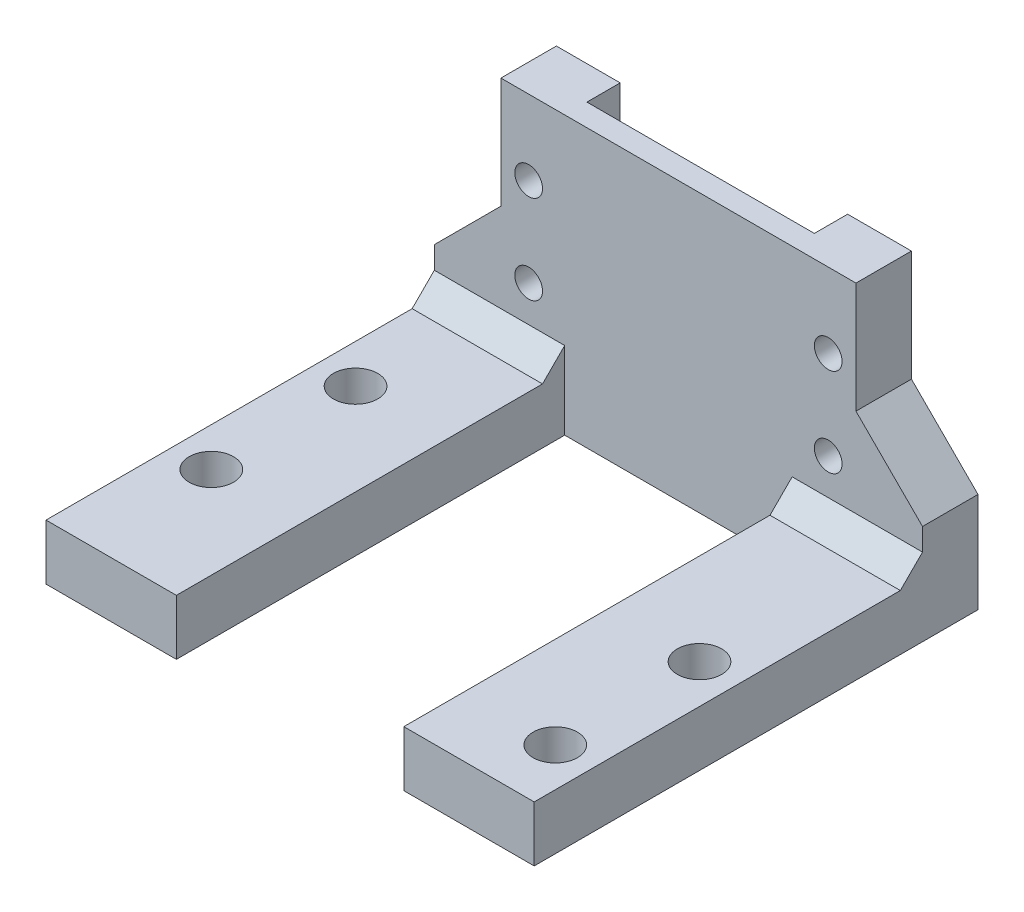
ISO-10303-21;
HEADER;
FILE_DESCRIPTION(('STEP AP214'),'2;1');
FILE_NAME('part.step','',(''),(''),'','','');
FILE_SCHEMA(('AUTOMOTIVE_DESIGN { 1 0 10303 214 1 1 1 1 }'));
ENDSEC;
DATA;
#1=APPLICATION_CONTEXT('core data for automotive mechanical design processes');
#2=APPLICATION_PROTOCOL_DEFINITION('international standard','automotive_design',2000,#1);
#3=PRODUCT_CONTEXT('',#1,'mechanical');
#4=PRODUCT('Part','Part','',(#3));
#5=PRODUCT_RELATED_PRODUCT_CATEGORY('part','',(#4));
#6=PRODUCT_DEFINITION_FORMATION('','',#4);
#7=PRODUCT_DEFINITION_CONTEXT('part definition',#1,'design');
#8=PRODUCT_DEFINITION('design','',#6,#7);
#9=PRODUCT_DEFINITION_SHAPE('','',#8);
#10=(LENGTH_UNIT() NAMED_UNIT(*) SI_UNIT(.MILLI.,.METRE.));
#11=(NAMED_UNIT(*) PLANE_ANGLE_UNIT() SI_UNIT($,.RADIAN.));
#12=(NAMED_UNIT(*) SI_UNIT($,.STERADIAN.) SOLID_ANGLE_UNIT());
#13=UNCERTAINTY_MEASURE_WITH_UNIT(LENGTH_MEASURE(1.E-05),#10,'distance_accuracy_value','');
#14=(GEOMETRIC_REPRESENTATION_CONTEXT(3) GLOBAL_UNCERTAINTY_ASSIGNED_CONTEXT((#13)) GLOBAL_UNIT_ASSIGNED_CONTEXT((#10,
#11,#12)) REPRESENTATION_CONTEXT('',''));
#15=CARTESIAN_POINT('',(0.,0.,0.));
#16=DIRECTION('',(0.,0.,1.));
#17=DIRECTION('',(1.,0.,0.));
#18=AXIS2_PLACEMENT_3D('',#15,#16,#17);
#19=CARTESIAN_POINT('',(0.,0.,2.));
#20=DIRECTION('',(0.,0.,1.));
#21=DIRECTION('',(1.,0.,0.));
#22=AXIS2_PLACEMENT_3D('',#19,#20,#21);
#23=PLANE('',#22);
#24=CARTESIAN_POINT('',(13.5,-2.25,2.));
#25=DIRECTION('',(0.,0.,1.));
#26=DIRECTION('',(1.,0.,0.));
#27=AXIS2_PLACEMENT_3D('',#24,#25,#26);
#28=CIRCLE('',#27,1.25);
#29=CARTESIAN_POINT('',(14.75,-2.25,2.));
#30=VERTEX_POINT('',#29);
#31=EDGE_CURVE('E808',#30,#30,#28,.F.);
#32=ORIENTED_EDGE('',*,*,#31,.T.);
#33=EDGE_LOOP('',(#32));
#34=FACE_BOUND('',#33,.T.);
#35=CARTESIAN_POINT('',(-13.5,-2.24999999999999,2.));
#36=DIRECTION('',(0.,0.,1.));
#37=DIRECTION('',(1.,0.,0.));
#38=AXIS2_PLACEMENT_3D('',#35,#36,#37);
#39=CIRCLE('',#38,1.25);
#40=CARTESIAN_POINT('',(-12.25,-2.24999999999999,2.));
#41=VERTEX_POINT('',#40);
#42=EDGE_CURVE('E805',#41,#41,#39,.T.);
#43=ORIENTED_EDGE('',*,*,#42,.F.);
#44=EDGE_LOOP('',(#43));
#45=FACE_BOUND('',#44,.T.);
#46=CARTESIAN_POINT('',(-13.5,5.75000000000001,2.));
#47=DIRECTION('',(0.,0.,1.));
#48=DIRECTION('',(1.,0.,0.));
#49=AXIS2_PLACEMENT_3D('',#46,#47,#48);
#50=CIRCLE('',#49,1.25);
#51=CARTESIAN_POINT('',(-12.25,5.75000000000001,2.));
#52=VERTEX_POINT('',#51);
#53=EDGE_CURVE('E215',#52,#52,#50,.T.);
#54=ORIENTED_EDGE('',*,*,#53,.F.);
#55=EDGE_LOOP('',(#54));
#56=FACE_BOUND('',#55,.T.);
#57=DIRECTION('',(0.,1.,0.));
#58=VECTOR('',#57,1.);
#59=CARTESIAN_POINT('',(-22.,0.,2.));
#60=LINE('',#59,#58);
#61=CARTESIAN_POINT('',(-22.,-5.49999999999999,2.));
#62=VERTEX_POINT('',#61);
#63=CARTESIAN_POINT('',(-22.,-3.49999999999987,2.));
#64=VERTEX_POINT('',#63);
#65=EDGE_CURVE('E338',#62,#64,#60,.T.);
#66=ORIENTED_EDGE('',*,*,#65,.F.);
#67=DIRECTION('',(1.,0.,0.));
#68=VECTOR('',#67,1.);
#69=CARTESIAN_POINT('',(0.,-5.49999999999999,2.));
#70=LINE('',#69,#68);
#71=CARTESIAN_POINT('',(-10.25,-5.49999999999999,2.));
#72=VERTEX_POINT('',#71);
#73=EDGE_CURVE('E345',#62,#72,#70,.T.);
#74=ORIENTED_EDGE('',*,*,#73,.T.);
#75=DIRECTION('',(0.,1.,0.));
#76=VECTOR('',#75,1.);
#77=CARTESIAN_POINT('',(-10.25,0.,2.));
#78=LINE('',#77,#76);
#79=CARTESIAN_POINT('',(-10.25,-12.5,2.));
#80=VERTEX_POINT('',#79);
#81=EDGE_CURVE('E221',#80,#72,#78,.T.);
#82=ORIENTED_EDGE('',*,*,#81,.F.);
#83=DIRECTION('',(1.,0.,0.));
#84=VECTOR('',#83,1.);
#85=CARTESIAN_POINT('',(16.,-12.5,2.));
#86=LINE('',#85,#84);
#87=CARTESIAN_POINT('',(10.25,-12.5,2.));
#88=VERTEX_POINT('',#87);
#89=EDGE_CURVE('E289',#80,#88,#86,.T.);
#90=ORIENTED_EDGE('',*,*,#89,.T.);
#91=DIRECTION('',(0.,1.,0.));
#92=VECTOR('',#91,1.);
#93=CARTESIAN_POINT('',(10.25,0.,2.));
#94=LINE('',#93,#92);
#95=CARTESIAN_POINT('',(10.25,-5.49999999999999,2.));
#96=VERTEX_POINT('',#95);
#97=EDGE_CURVE('E243',#88,#96,#94,.T.);
#98=ORIENTED_EDGE('',*,*,#97,.T.);
#99=DIRECTION('',(1.,0.,0.));
#100=VECTOR('',#99,1.);
#101=CARTESIAN_POINT('',(0.,-5.49999999999999,2.));
#102=LINE('',#101,#100);
#103=CARTESIAN_POINT('',(22.,-5.49999999999999,2.));
#104=VERTEX_POINT('',#103);
#105=EDGE_CURVE('E341',#96,#104,#102,.T.);
#106=ORIENTED_EDGE('',*,*,#105,.T.);
#107=DIRECTION('',(0.,-1.,0.));
#108=VECTOR('',#107,1.);
#109=CARTESIAN_POINT('',(22.,0.,2.));
#110=LINE('',#109,#108);
#111=CARTESIAN_POINT('',(22.,-3.49999999999986,2.));
#112=VERTEX_POINT('',#111);
#113=EDGE_CURVE('E339',#104,#112,#110,.F.);
#114=ORIENTED_EDGE('',*,*,#113,.T.);
#115=DIRECTION('',(0.707106781186551,-0.707106781186544,0.));
#116=VECTOR('',#115,1.);
#117=CARTESIAN_POINT('',(26.0000000000002,-7.5,2.));
#118=LINE('',#117,#116);
#119=CARTESIAN_POINT('',(16.,2.50000000000007,2.));
#120=VERTEX_POINT('',#119);
#121=EDGE_CURVE('E325',#112,#120,#118,.F.);
#122=ORIENTED_EDGE('',*,*,#121,.T.);
#123=DIRECTION('',(0.,1.,0.));
#124=VECTOR('',#123,1.);
#125=CARTESIAN_POINT('',(16.,-12.5,2.));
#126=LINE('',#125,#124);
#127=CARTESIAN_POINT('',(16.,12.5,2.));
#128=VERTEX_POINT('',#127);
#129=EDGE_CURVE('E292',#120,#128,#126,.T.);
#130=ORIENTED_EDGE('',*,*,#129,.T.);
#131=DIRECTION('',(-1.,0.,0.));
#132=VECTOR('',#131,1.);
#133=CARTESIAN_POINT('',(16.,12.5,2.));
#134=LINE('',#133,#132);
#135=CARTESIAN_POINT('',(-16.,12.5,2.));
#136=VERTEX_POINT('',#135);
#137=EDGE_CURVE('E294',#128,#136,#134,.T.);
#138=ORIENTED_EDGE('',*,*,#137,.T.);
#139=DIRECTION('',(0.,-1.,0.));
#140=VECTOR('',#139,1.);
#141=CARTESIAN_POINT('',(-16.,-12.5,2.));
#142=LINE('',#141,#140);
#143=CARTESIAN_POINT('',(-16.,2.50000000000007,2.));
#144=VERTEX_POINT('',#143);
#145=EDGE_CURVE('E286',#136,#144,#142,.T.);
#146=ORIENTED_EDGE('',*,*,#145,.T.);
#147=DIRECTION('',(0.707106781186551,0.707106781186544,0.));
#148=VECTOR('',#147,1.);
#149=CARTESIAN_POINT('',(-26.0000000000002,-7.5,2.));
#150=LINE('',#149,#148);
#151=EDGE_CURVE('E335',#144,#64,#150,.F.);
#152=ORIENTED_EDGE('',*,*,#151,.T.);
#153=EDGE_LOOP('',(#66,#74,#82,#90,#98,#106,#114,#122,#130,#138,#146,#152));
#154=FACE_BOUND('',#153,.T.);
#155=CARTESIAN_POINT('',(13.5,5.75000000000001,2.));
#156=DIRECTION('',(0.,0.,1.));
#157=DIRECTION('',(1.,0.,0.));
#158=AXIS2_PLACEMENT_3D('',#155,#156,#157);
#159=CIRCLE('',#158,1.25);
#160=CARTESIAN_POINT('',(14.75,5.75000000000001,2.));
#161=VERTEX_POINT('',#160);
#162=EDGE_CURVE('E804',#161,#161,#159,.F.);
#163=ORIENTED_EDGE('',*,*,#162,.T.);
#164=EDGE_LOOP('',(#163));
#165=FACE_BOUND('',#164,.T.);
#166=ADVANCED_FACE('F45',(#34,#45,#56,#154,#165),#23,.T.);
#167=CARTESIAN_POINT('',(-16.,-12.5,2.));
#168=DIRECTION('',(1.,0.,0.));
#169=DIRECTION('',(0.,0.,-1.));
#170=AXIS2_PLACEMENT_3D('',#167,#168,#169);
#171=PLANE('',#170);
#172=DIRECTION('',(0.,1.,0.));
#173=VECTOR('',#172,1.);
#174=CARTESIAN_POINT('',(-16.,0.,-3.));
#175=LINE('',#174,#173);
#176=CARTESIAN_POINT('',(-16.,2.50000000000007,-3.));
#177=VERTEX_POINT('',#176);
#178=CARTESIAN_POINT('',(-16.,12.5,-3.));
#179=VERTEX_POINT('',#178);
#180=EDGE_CURVE('E259',#177,#179,#175,.T.);
#181=ORIENTED_EDGE('',*,*,#180,.F.);
#182=DIRECTION('',(0.,0.,1.));
#183=VECTOR('',#182,1.);
#184=CARTESIAN_POINT('',(-16.,2.50000000000007,2.));
#185=LINE('',#184,#183);
#186=EDGE_CURVE('E319',#177,#144,#185,.T.);
#187=ORIENTED_EDGE('',*,*,#186,.T.);
#188=ORIENTED_EDGE('',*,*,#145,.F.);
#189=DIRECTION('',(0.,0.,-1.));
#190=VECTOR('',#189,1.);
#191=CARTESIAN_POINT('',(-16.,12.5,2.));
#192=LINE('',#191,#190);
#193=EDGE_CURVE('E296',#136,#179,#192,.T.);
#194=ORIENTED_EDGE('',*,*,#193,.T.);
#195=EDGE_LOOP('',(#181,#187,#188,#194));
#196=FACE_BOUND('',#195,.T.);
#197=ADVANCED_FACE('F396',(#196),#171,.F.);
#198=CARTESIAN_POINT('',(16.,-12.5,2.));
#199=DIRECTION('',(-1.,0.,0.));
#200=DIRECTION('',(0.,0.,1.));
#201=AXIS2_PLACEMENT_3D('',#198,#199,#200);
#202=PLANE('',#201);
#203=ORIENTED_EDGE('',*,*,#129,.F.);
#204=DIRECTION('',(0.,0.,-1.));
#205=VECTOR('',#204,1.);
#206=CARTESIAN_POINT('',(16.,2.50000000000007,-3.));
#207=LINE('',#206,#205);
#208=CARTESIAN_POINT('',(16.,2.50000000000007,-3.));
#209=VERTEX_POINT('',#208);
#210=EDGE_CURVE('E305',#120,#209,#207,.T.);
#211=ORIENTED_EDGE('',*,*,#210,.T.);
#212=DIRECTION('',(0.,-1.,0.));
#213=VECTOR('',#212,1.);
#214=CARTESIAN_POINT('',(16.,0.,-3.));
#215=LINE('',#214,#213);
#216=CARTESIAN_POINT('',(16.,12.5,-3.));
#217=VERTEX_POINT('',#216);
#218=EDGE_CURVE('E273',#217,#209,#215,.T.);
#219=ORIENTED_EDGE('',*,*,#218,.F.);
#220=DIRECTION('',(0.,0.,-1.));
#221=VECTOR('',#220,1.);
#222=CARTESIAN_POINT('',(16.,12.5,2.));
#223=LINE('',#222,#221);
#224=EDGE_CURVE('E303',#128,#217,#223,.T.);
#225=ORIENTED_EDGE('',*,*,#224,.F.);
#226=EDGE_LOOP('',(#203,#211,#219,#225));
#227=FACE_BOUND('',#226,.T.);
#228=ADVANCED_FACE('F385',(#227),#202,.F.);
#229=CARTESIAN_POINT('',(0.,0.,0.));
#230=DIRECTION('',(0.,0.,1.));
#231=DIRECTION('',(1.,0.,0.));
#232=AXIS2_PLACEMENT_3D('',#229,#230,#231);
#233=PLANE('',#232);
#234=DIRECTION('',(0.,-1.,0.));
#235=VECTOR('',#234,1.);
#236=CARTESIAN_POINT('',(-10.25,0.,0.));
#237=LINE('',#236,#235);
#238=CARTESIAN_POINT('',(-10.25,12.5,0.));
#239=VERTEX_POINT('',#238);
#240=CARTESIAN_POINT('',(-10.25,-12.5,0.));
#241=VERTEX_POINT('',#240);
#242=EDGE_CURVE('E251',#239,#241,#237,.T.);
#243=ORIENTED_EDGE('',*,*,#242,.F.);
#244=DIRECTION('',(-1.,0.,0.));
#245=VECTOR('',#244,1.);
#246=CARTESIAN_POINT('',(16.,12.5,0.));
#247=LINE('',#246,#245);
#248=CARTESIAN_POINT('',(10.25,12.5,0.));
#249=VERTEX_POINT('',#248);
#250=EDGE_CURVE('E290',#249,#239,#247,.T.);
#251=ORIENTED_EDGE('',*,*,#250,.F.);
#252=DIRECTION('',(0.,-1.,0.));
#253=VECTOR('',#252,1.);
#254=CARTESIAN_POINT('',(10.25,0.,0.));
#255=LINE('',#254,#253);
#256=CARTESIAN_POINT('',(10.25,-12.5,0.));
#257=VERTEX_POINT('',#256);
#258=EDGE_CURVE('E267',#249,#257,#255,.T.);
#259=ORIENTED_EDGE('',*,*,#258,.T.);
#260=DIRECTION('',(1.,0.,0.));
#261=VECTOR('',#260,1.);
#262=CARTESIAN_POINT('',(16.,-12.5,0.));
#263=LINE('',#262,#261);
#264=EDGE_CURVE('E285',#241,#257,#263,.T.);
#265=ORIENTED_EDGE('',*,*,#264,.F.);
#266=EDGE_LOOP('',(#243,#251,#259,#265));
#267=FACE_BOUND('',#266,.T.);
#268=ADVANCED_FACE('F410',(#267),#233,.F.);
#269=CARTESIAN_POINT('',(16.,-12.5,2.));
#270=DIRECTION('',(0.,1.,0.));
#271=DIRECTION('',(-1.,0.,0.));
#272=AXIS2_PLACEMENT_3D('',#269,#270,#271);
#273=PLANE('',#272);
#274=CARTESIAN_POINT('',(18.5,-12.5,31.6));
#275=DIRECTION('',(0.,1.,0.));
#276=DIRECTION('',(-1.,0.,0.));
#277=AXIS2_PLACEMENT_3D('',#274,#275,#276);
#278=CIRCLE('',#277,2.);
#279=CARTESIAN_POINT('',(16.5,-12.5,31.6));
#280=VERTEX_POINT('',#279);
#281=EDGE_CURVE('E801',#280,#280,#278,.T.);
#282=ORIENTED_EDGE('',*,*,#281,.T.);
#283=EDGE_LOOP('',(#282));
#284=FACE_BOUND('',#283,.T.);
#285=CARTESIAN_POINT('',(18.5,-12.5,18.6));
#286=DIRECTION('',(0.,1.,0.));
#287=DIRECTION('',(-1.,0.,0.));
#288=AXIS2_PLACEMENT_3D('',#285,#286,#287);
#289=CIRCLE('',#288,2.);
#290=CARTESIAN_POINT('',(16.5,-12.5,18.6));
#291=VERTEX_POINT('',#290);
#292=EDGE_CURVE('E798',#291,#291,#289,.T.);
#293=ORIENTED_EDGE('',*,*,#292,.T.);
#294=EDGE_LOOP('',(#293));
#295=FACE_BOUND('',#294,.T.);
#296=CARTESIAN_POINT('',(-18.5,-12.5,25.6));
#297=DIRECTION('',(0.,1.,0.));
#298=DIRECTION('',(-1.,0.,0.));
#299=AXIS2_PLACEMENT_3D('',#296,#297,#298);
#300=CIRCLE('',#299,2.);
#301=CARTESIAN_POINT('',(-20.5,-12.5,25.6));
#302=VERTEX_POINT('',#301);
#303=EDGE_CURVE('E795',#302,#302,#300,.T.);
#304=ORIENTED_EDGE('',*,*,#303,.T.);
#305=EDGE_LOOP('',(#304));
#306=FACE_BOUND('',#305,.T.);
#307=CARTESIAN_POINT('',(-18.5,-12.5,12.6));
#308=DIRECTION('',(0.,1.,0.));
#309=DIRECTION('',(-1.,0.,0.));
#310=AXIS2_PLACEMENT_3D('',#307,#308,#309);
#311=CIRCLE('',#310,2.);
#312=CARTESIAN_POINT('',(-20.5,-12.5,12.6));
#313=VERTEX_POINT('',#312);
#314=EDGE_CURVE('E785',#313,#313,#311,.T.);
#315=ORIENTED_EDGE('',*,*,#314,.T.);
#316=EDGE_LOOP('',(#315));
#317=FACE_BOUND('',#316,.T.);
#318=ORIENTED_EDGE('',*,*,#89,.F.);
#319=DIRECTION('',(0.,0.,-1.));
#320=VECTOR('',#319,1.);
#321=CARTESIAN_POINT('',(-10.25,-12.5,37.));
#322=LINE('',#321,#320);
#323=CARTESIAN_POINT('',(-10.25,-12.5,37.));
#324=VERTEX_POINT('',#323);
#325=EDGE_CURVE('E222',#324,#80,#322,.T.);
#326=ORIENTED_EDGE('',*,*,#325,.F.);
#327=DIRECTION('',(-1.,0.,0.));
#328=VECTOR('',#327,1.);
#329=CARTESIAN_POINT('',(0.,-12.5,37.));
#330=LINE('',#329,#328);
#331=CARTESIAN_POINT('',(-22.,-12.5,37.));
#332=VERTEX_POINT('',#331);
#333=EDGE_CURVE('E203',#324,#332,#330,.T.);
#334=ORIENTED_EDGE('',*,*,#333,.T.);
#335=DIRECTION('',(0.,0.,-1.));
#336=VECTOR('',#335,1.);
#337=CARTESIAN_POINT('',(-22.,-12.5,37.));
#338=LINE('',#337,#336);
#339=CARTESIAN_POINT('',(-22.,-12.5,-3.));
#340=VERTEX_POINT('',#339);
#341=EDGE_CURVE('E208',#332,#340,#338,.T.);
#342=ORIENTED_EDGE('',*,*,#341,.T.);
#343=DIRECTION('',(-1.,0.,0.));
#344=VECTOR('',#343,1.);
#345=CARTESIAN_POINT('',(0.,-12.5,-3.));
#346=LINE('',#345,#344);
#347=CARTESIAN_POINT('',(-10.25,-12.5,-3.));
#348=VERTEX_POINT('',#347);
#349=EDGE_CURVE('E257',#348,#340,#346,.T.);
#350=ORIENTED_EDGE('',*,*,#349,.F.);
#351=DIRECTION('',(0.,0.,1.));
#352=VECTOR('',#351,1.);
#353=CARTESIAN_POINT('',(-10.25,-12.5,-3.));
#354=LINE('',#353,#352);
#355=EDGE_CURVE('E261',#348,#241,#354,.T.);
#356=ORIENTED_EDGE('',*,*,#355,.T.);
#357=ORIENTED_EDGE('',*,*,#264,.T.);
#358=DIRECTION('',(0.,0.,1.));
#359=VECTOR('',#358,1.);
#360=CARTESIAN_POINT('',(10.25,-12.5,-3.));
#361=LINE('',#360,#359);
#362=CARTESIAN_POINT('',(10.25,-12.5,-3.));
#363=VERTEX_POINT('',#362);
#364=EDGE_CURVE('E279',#363,#257,#361,.T.);
#365=ORIENTED_EDGE('',*,*,#364,.F.);
#366=DIRECTION('',(-1.,0.,0.));
#367=VECTOR('',#366,1.);
#368=CARTESIAN_POINT('',(0.,-12.5,-3.));
#369=LINE('',#368,#367);
#370=CARTESIAN_POINT('',(22.,-12.5,-3.));
#371=VERTEX_POINT('',#370);
#372=EDGE_CURVE('E276',#371,#363,#369,.T.);
#373=ORIENTED_EDGE('',*,*,#372,.F.);
#374=DIRECTION('',(0.,0.,-1.));
#375=VECTOR('',#374,1.);
#376=CARTESIAN_POINT('',(22.,-12.5,37.));
#377=LINE('',#376,#375);
#378=CARTESIAN_POINT('',(22.,-12.5,37.));
#379=VERTEX_POINT('',#378);
#380=EDGE_CURVE('E244',#379,#371,#377,.T.);
#381=ORIENTED_EDGE('',*,*,#380,.F.);
#382=DIRECTION('',(-1.,0.,0.));
#383=VECTOR('',#382,1.);
#384=CARTESIAN_POINT('',(0.,-12.5,37.));
#385=LINE('',#384,#383);
#386=CARTESIAN_POINT('',(10.25,-12.5,37.));
#387=VERTEX_POINT('',#386);
#388=EDGE_CURVE('E234',#379,#387,#385,.T.);
#389=ORIENTED_EDGE('',*,*,#388,.T.);
#390=DIRECTION('',(0.,0.,-1.));
#391=VECTOR('',#390,1.);
#392=CARTESIAN_POINT('',(10.25,-12.5,37.));
#393=LINE('',#392,#391);
#394=EDGE_CURVE('E240',#387,#88,#393,.T.);
#395=ORIENTED_EDGE('',*,*,#394,.T.);
#396=EDGE_LOOP('',(#318,#326,#334,#342,#350,#356,#357,#365,#373,#381,#389,#395));
#397=FACE_BOUND('',#396,.T.);
#398=ADVANCED_FACE('F367',(#284,#295,#306,#317,#397),#273,.F.);
#399=CARTESIAN_POINT('',(16.,12.5,2.));
#400=DIRECTION('',(0.,-1.,0.));
#401=DIRECTION('',(1.,0.,0.));
#402=AXIS2_PLACEMENT_3D('',#399,#400,#401);
#403=PLANE('',#402);
#404=ORIENTED_EDGE('',*,*,#224,.T.);
#405=DIRECTION('',(1.,0.,0.));
#406=VECTOR('',#405,1.);
#407=CARTESIAN_POINT('',(0.,12.5,-3.));
#408=LINE('',#407,#406);
#409=CARTESIAN_POINT('',(10.25,12.5,-3.));
#410=VERTEX_POINT('',#409);
#411=EDGE_CURVE('E270',#410,#217,#408,.T.);
#412=ORIENTED_EDGE('',*,*,#411,.F.);
#413=DIRECTION('',(0.,0.,1.));
#414=VECTOR('',#413,1.);
#415=CARTESIAN_POINT('',(10.25,12.5,-3.));
#416=LINE('',#415,#414);
#417=EDGE_CURVE('E283',#410,#249,#416,.T.);
#418=ORIENTED_EDGE('',*,*,#417,.T.);
#419=ORIENTED_EDGE('',*,*,#250,.T.);
#420=DIRECTION('',(0.,0.,1.));
#421=VECTOR('',#420,1.);
#422=CARTESIAN_POINT('',(-10.25,12.5,-3.));
#423=LINE('',#422,#421);
#424=CARTESIAN_POINT('',(-10.25,12.5,-3.));
#425=VERTEX_POINT('',#424);
#426=EDGE_CURVE('E265',#425,#239,#423,.T.);
#427=ORIENTED_EDGE('',*,*,#426,.F.);
#428=DIRECTION('',(1.,0.,0.));
#429=VECTOR('',#428,1.);
#430=CARTESIAN_POINT('',(0.,12.5,-3.));
#431=LINE('',#430,#429);
#432=EDGE_CURVE('E252',#179,#425,#431,.T.);
#433=ORIENTED_EDGE('',*,*,#432,.F.);
#434=ORIENTED_EDGE('',*,*,#193,.F.);
#435=ORIENTED_EDGE('',*,*,#137,.F.);
#436=EDGE_LOOP('',(#404,#412,#418,#419,#427,#433,#434,#435));
#437=FACE_BOUND('',#436,.T.);
#438=ADVANCED_FACE('F391',(#437),#403,.F.);
#439=CARTESIAN_POINT('',(10.25,0.,-3.));
#440=DIRECTION('',(-1.,0.,0.));
#441=DIRECTION('',(0.,-1.,0.));
#442=AXIS2_PLACEMENT_3D('',#439,#440,#441);
#443=PLANE('',#442);
#444=ORIENTED_EDGE('',*,*,#364,.T.);
#445=ORIENTED_EDGE('',*,*,#258,.F.);
#446=ORIENTED_EDGE('',*,*,#417,.F.);
#447=DIRECTION('',(0.,-1.,0.));
#448=VECTOR('',#447,1.);
#449=CARTESIAN_POINT('',(10.25,0.,-3.));
#450=LINE('',#449,#448);
#451=EDGE_CURVE('E268',#410,#363,#450,.T.);
#452=ORIENTED_EDGE('',*,*,#451,.T.);
#453=EDGE_LOOP('',(#444,#445,#446,#452));
#454=FACE_BOUND('',#453,.T.);
#455=ADVANCED_FACE('F414',(#454),#443,.T.);
#456=CARTESIAN_POINT('',(0.,0.,-3.));
#457=DIRECTION('',(0.,0.,-1.));
#458=DIRECTION('',(-1.,0.,0.));
#459=AXIS2_PLACEMENT_3D('',#456,#457,#458);
#460=PLANE('',#459);
#461=CARTESIAN_POINT('',(13.5,5.75000000000001,-3.));
#462=DIRECTION('',(0.,0.,-1.));
#463=DIRECTION('',(-1.,0.,0.));
#464=AXIS2_PLACEMENT_3D('',#461,#462,#463);
#465=CIRCLE('',#464,1.25);
#466=CARTESIAN_POINT('',(12.25,5.75000000000001,-3.));
#467=VERTEX_POINT('',#466);
#468=EDGE_CURVE('E212',#467,#467,#465,.F.);
#469=ORIENTED_EDGE('',*,*,#468,.T.);
#470=EDGE_LOOP('',(#469));
#471=FACE_BOUND('',#470,.T.);
#472=CARTESIAN_POINT('',(13.5,-2.25,-3.));
#473=DIRECTION('',(0.,0.,-1.));
#474=DIRECTION('',(-1.,0.,0.));
#475=AXIS2_PLACEMENT_3D('',#472,#473,#474);
#476=CIRCLE('',#475,1.25);
#477=CARTESIAN_POINT('',(12.25,-2.25,-3.));
#478=VERTEX_POINT('',#477);
#479=EDGE_CURVE('E312',#478,#478,#476,.F.);
#480=ORIENTED_EDGE('',*,*,#479,.T.);
#481=EDGE_LOOP('',(#480));
#482=FACE_BOUND('',#481,.T.);
#483=ORIENTED_EDGE('',*,*,#372,.T.);
#484=ORIENTED_EDGE('',*,*,#451,.F.);
#485=ORIENTED_EDGE('',*,*,#411,.T.);
#486=ORIENTED_EDGE('',*,*,#218,.T.);
#487=DIRECTION('',(-0.707106781186551,0.707106781186544,0.));
#488=VECTOR('',#487,1.);
#489=CARTESIAN_POINT('',(26.0000000000002,-7.5,-3.));
#490=LINE('',#489,#488);
#491=CARTESIAN_POINT('',(22.,-3.49999999999986,-3.));
#492=VERTEX_POINT('',#491);
#493=EDGE_CURVE('E327',#209,#492,#490,.F.);
#494=ORIENTED_EDGE('',*,*,#493,.T.);
#495=DIRECTION('',(0.,-1.,0.));
#496=VECTOR('',#495,1.);
#497=CARTESIAN_POINT('',(22.,0.,-3.));
#498=LINE('',#497,#496);
#499=EDGE_CURVE('E226',#492,#371,#498,.T.);
#500=ORIENTED_EDGE('',*,*,#499,.T.);
#501=EDGE_LOOP('',(#483,#484,#485,#486,#494,#500));
#502=FACE_BOUND('',#501,.T.);
#503=ADVANCED_FACE('F418',(#471,#482,#502),#460,.T.);
#504=CARTESIAN_POINT('',(-10.25,0.,-3.));
#505=DIRECTION('',(-1.,0.,0.));
#506=DIRECTION('',(0.,-1.,0.));
#507=AXIS2_PLACEMENT_3D('',#504,#505,#506);
#508=PLANE('',#507);
#509=ORIENTED_EDGE('',*,*,#355,.F.);
#510=DIRECTION('',(0.,-1.,0.));
#511=VECTOR('',#510,1.);
#512=CARTESIAN_POINT('',(-10.25,0.,-3.));
#513=LINE('',#512,#511);
#514=EDGE_CURVE('E255',#425,#348,#513,.T.);
#515=ORIENTED_EDGE('',*,*,#514,.F.);
#516=ORIENTED_EDGE('',*,*,#426,.T.);
#517=ORIENTED_EDGE('',*,*,#242,.T.);
#518=EDGE_LOOP('',(#509,#515,#516,#517));
#519=FACE_BOUND('',#518,.T.);
#520=ADVANCED_FACE('F420',(#519),#508,.F.);
#521=CARTESIAN_POINT('',(0.,0.,-3.));
#522=DIRECTION('',(0.,0.,-1.));
#523=DIRECTION('',(-1.,0.,0.));
#524=AXIS2_PLACEMENT_3D('',#521,#522,#523);
#525=PLANE('',#524);
#526=CARTESIAN_POINT('',(-13.5,-2.24999999999999,-3.));
#527=DIRECTION('',(0.,0.,-1.));
#528=DIRECTION('',(-1.,0.,0.));
#529=AXIS2_PLACEMENT_3D('',#526,#527,#528);
#530=CIRCLE('',#529,1.25);
#531=CARTESIAN_POINT('',(-14.75,-2.24999999999999,-3.));
#532=VERTEX_POINT('',#531);
#533=EDGE_CURVE('E309',#532,#532,#530,.T.);
#534=ORIENTED_EDGE('',*,*,#533,.F.);
#535=EDGE_LOOP('',(#534));
#536=FACE_BOUND('',#535,.T.);
#537=CARTESIAN_POINT('',(-13.5,5.75000000000001,-3.));
#538=DIRECTION('',(0.,0.,-1.));
#539=DIRECTION('',(-1.,0.,0.));
#540=AXIS2_PLACEMENT_3D('',#537,#538,#539);
#541=CIRCLE('',#540,1.25);
#542=CARTESIAN_POINT('',(-14.75,5.75000000000001,-3.));
#543=VERTEX_POINT('',#542);
#544=EDGE_CURVE('E306',#543,#543,#541,.T.);
#545=ORIENTED_EDGE('',*,*,#544,.F.);
#546=EDGE_LOOP('',(#545));
#547=FACE_BOUND('',#546,.T.);
#548=ORIENTED_EDGE('',*,*,#349,.T.);
#549=DIRECTION('',(0.,-1.,0.));
#550=VECTOR('',#549,1.);
#551=CARTESIAN_POINT('',(-22.,0.,-3.));
#552=LINE('',#551,#550);
#553=CARTESIAN_POINT('',(-22.,-3.49999999999987,-3.));
#554=VERTEX_POINT('',#553);
#555=EDGE_CURVE('E210',#554,#340,#552,.T.);
#556=ORIENTED_EDGE('',*,*,#555,.F.);
#557=DIRECTION('',(-0.707106781186551,-0.707106781186544,0.));
#558=VECTOR('',#557,1.);
#559=CARTESIAN_POINT('',(-26.0000000000002,-7.5,-3.));
#560=LINE('',#559,#558);
#561=EDGE_CURVE('E333',#554,#177,#560,.F.);
#562=ORIENTED_EDGE('',*,*,#561,.T.);
#563=ORIENTED_EDGE('',*,*,#180,.T.);
#564=ORIENTED_EDGE('',*,*,#432,.T.);
#565=ORIENTED_EDGE('',*,*,#514,.T.);
#566=EDGE_LOOP('',(#548,#556,#562,#563,#564,#565));
#567=FACE_BOUND('',#566,.T.);
#568=ADVANCED_FACE('F402',(#536,#547,#567),#525,.T.);
#569=CARTESIAN_POINT('',(0.,-7.5,37.));
#570=DIRECTION('',(0.,-1.,0.));
#571=DIRECTION('',(0.,0.,-1.));
#572=AXIS2_PLACEMENT_3D('',#569,#570,#571);
#573=PLANE('',#572);
#574=CARTESIAN_POINT('',(18.5,-7.5,31.6));
#575=DIRECTION('',(0.,1.,0.));
#576=DIRECTION('',(-1.,0.,0.));
#577=AXIS2_PLACEMENT_3D('',#574,#575,#576);
#578=CIRCLE('',#577,2.);
#579=CARTESIAN_POINT('',(16.5,-7.5,31.6));
#580=VERTEX_POINT('',#579);
#581=EDGE_CURVE('E778',#580,#580,#578,.T.);
#582=ORIENTED_EDGE('',*,*,#581,.F.);
#583=EDGE_LOOP('',(#582));
#584=FACE_BOUND('',#583,.T.);
#585=CARTESIAN_POINT('',(18.5,-7.5,18.6));
#586=DIRECTION('',(0.,1.,0.));
#587=DIRECTION('',(-1.,0.,0.));
#588=AXIS2_PLACEMENT_3D('',#585,#586,#587);
#589=CIRCLE('',#588,2.);
#590=CARTESIAN_POINT('',(16.5,-7.5,18.6));
#591=VERTEX_POINT('',#590);
#592=EDGE_CURVE('E781',#591,#591,#589,.T.);
#593=ORIENTED_EDGE('',*,*,#592,.F.);
#594=EDGE_LOOP('',(#593));
#595=FACE_BOUND('',#594,.T.);
#596=DIRECTION('',(0.,0.,-1.));
#597=VECTOR('',#596,1.);
#598=CARTESIAN_POINT('',(22.,-7.5,37.));
#599=LINE('',#598,#597);
#600=CARTESIAN_POINT('',(22.,-7.5,37.));
#601=VERTEX_POINT('',#600);
#602=CARTESIAN_POINT('',(22.,-7.5,3.99999999999999));
#603=VERTEX_POINT('',#602);
#604=EDGE_CURVE('E247',#601,#603,#599,.T.);
#605=ORIENTED_EDGE('',*,*,#604,.T.);
#606=DIRECTION('',(-1.,0.,0.));
#607=VECTOR('',#606,1.);
#608=CARTESIAN_POINT('',(0.,-7.5,3.99999999999999));
#609=LINE('',#608,#607);
#610=CARTESIAN_POINT('',(10.25,-7.5,3.99999999999999));
#611=VERTEX_POINT('',#610);
#612=EDGE_CURVE('E61',#603,#611,#609,.T.);
#613=ORIENTED_EDGE('',*,*,#612,.T.);
#614=DIRECTION('',(0.,0.,-1.));
#615=VECTOR('',#614,1.);
#616=CARTESIAN_POINT('',(10.25,-7.5,37.));
#617=LINE('',#616,#615);
#618=CARTESIAN_POINT('',(10.25,-7.5,37.));
#619=VERTEX_POINT('',#618);
#620=EDGE_CURVE('E237',#619,#611,#617,.T.);
#621=ORIENTED_EDGE('',*,*,#620,.F.);
#622=DIRECTION('',(-1.,0.,0.));
#623=VECTOR('',#622,1.);
#624=CARTESIAN_POINT('',(0.,-7.5,37.));
#625=LINE('',#624,#623);
#626=EDGE_CURVE('E229',#601,#619,#625,.T.);
#627=ORIENTED_EDGE('',*,*,#626,.F.);
#628=EDGE_LOOP('',(#605,#613,#621,#627));
#629=FACE_BOUND('',#628,.T.);
#630=ADVANCED_FACE('F428',(#584,#595,#629),#573,.F.);
#631=CARTESIAN_POINT('',(10.25,0.,37.));
#632=DIRECTION('',(1.,0.,0.));
#633=DIRECTION('',(0.,0.,-1.));
#634=AXIS2_PLACEMENT_3D('',#631,#632,#633);
#635=PLANE('',#634);
#636=ORIENTED_EDGE('',*,*,#97,.F.);
#637=ORIENTED_EDGE('',*,*,#394,.F.);
#638=DIRECTION('',(0.,-1.,0.));
#639=VECTOR('',#638,1.);
#640=CARTESIAN_POINT('',(10.25,0.,37.));
#641=LINE('',#640,#639);
#642=EDGE_CURVE('E227',#619,#387,#641,.T.);
#643=ORIENTED_EDGE('',*,*,#642,.F.);
#644=ORIENTED_EDGE('',*,*,#620,.T.);
#645=DIRECTION('',(0.,0.707106781186551,-0.707106781186544));
#646=VECTOR('',#645,1.);
#647=CARTESIAN_POINT('',(10.25,-20.25,16.7499999999998));
#648=LINE('',#647,#646);
#649=EDGE_CURVE('E11',#611,#96,#648,.T.);
#650=ORIENTED_EDGE('',*,*,#649,.T.);
#651=EDGE_LOOP('',(#636,#637,#643,#644,#650));
#652=FACE_BOUND('',#651,.T.);
#653=ADVANCED_FACE('F372',(#652),#635,.F.);
#654=CARTESIAN_POINT('',(22.,0.,37.));
#655=DIRECTION('',(1.,0.,0.));
#656=DIRECTION('',(0.,0.,-1.));
#657=AXIS2_PLACEMENT_3D('',#654,#655,#656);
#658=PLANE('',#657);
#659=ORIENTED_EDGE('',*,*,#499,.F.);
#660=DIRECTION('',(0.,0.,-1.));
#661=VECTOR('',#660,1.);
#662=CARTESIAN_POINT('',(22.,-3.49999999999986,37.));
#663=LINE('',#662,#661);
#664=EDGE_CURVE('E322',#492,#112,#663,.F.);
#665=ORIENTED_EDGE('',*,*,#664,.T.);
#666=ORIENTED_EDGE('',*,*,#113,.F.);
#667=DIRECTION('',(0.,-0.707106781186551,0.707106781186544));
#668=VECTOR('',#667,1.);
#669=CARTESIAN_POINT('',(22.,-5.49999999999999,2.));
#670=LINE('',#669,#668);
#671=EDGE_CURVE('E54',#104,#603,#670,.T.);
#672=ORIENTED_EDGE('',*,*,#671,.T.);
#673=ORIENTED_EDGE('',*,*,#604,.F.);
#674=DIRECTION('',(0.,-1.,0.));
#675=VECTOR('',#674,1.);
#676=CARTESIAN_POINT('',(22.,0.,37.));
#677=LINE('',#676,#675);
#678=EDGE_CURVE('E231',#601,#379,#677,.T.);
#679=ORIENTED_EDGE('',*,*,#678,.T.);
#680=ORIENTED_EDGE('',*,*,#380,.T.);
#681=EDGE_LOOP('',(#659,#665,#666,#672,#673,#679,#680));
#682=FACE_BOUND('',#681,.T.);
#683=ADVANCED_FACE('F376',(#682),#658,.T.);
#684=CARTESIAN_POINT('',(0.,0.,37.));
#685=DIRECTION('',(0.,0.,-1.));
#686=DIRECTION('',(-1.,0.,0.));
#687=AXIS2_PLACEMENT_3D('',#684,#685,#686);
#688=PLANE('',#687);
#689=ORIENTED_EDGE('',*,*,#642,.T.);
#690=ORIENTED_EDGE('',*,*,#388,.F.);
#691=ORIENTED_EDGE('',*,*,#678,.F.);
#692=ORIENTED_EDGE('',*,*,#626,.T.);
#693=EDGE_LOOP('',(#689,#690,#691,#692));
#694=FACE_BOUND('',#693,.T.);
#695=ADVANCED_FACE('F589',(#694),#688,.F.);
#696=CARTESIAN_POINT('',(-22.,0.,37.));
#697=DIRECTION('',(1.,0.,0.));
#698=DIRECTION('',(0.,0.,-1.));
#699=AXIS2_PLACEMENT_3D('',#696,#697,#698);
#700=PLANE('',#699);
#701=ORIENTED_EDGE('',*,*,#555,.T.);
#702=ORIENTED_EDGE('',*,*,#341,.F.);
#703=DIRECTION('',(0.,-1.,0.));
#704=VECTOR('',#703,1.);
#705=CARTESIAN_POINT('',(-22.,0.,37.));
#706=LINE('',#705,#704);
#707=CARTESIAN_POINT('',(-22.,-7.5,37.));
#708=VERTEX_POINT('',#707);
#709=EDGE_CURVE('E188',#708,#332,#706,.T.);
#710=ORIENTED_EDGE('',*,*,#709,.F.);
#711=DIRECTION('',(0.,0.,-1.));
#712=VECTOR('',#711,1.);
#713=CARTESIAN_POINT('',(-22.,-7.5,37.));
#714=LINE('',#713,#712);
#715=CARTESIAN_POINT('',(-22.,-7.5,3.99999999999999));
#716=VERTEX_POINT('',#715);
#717=EDGE_CURVE('E196',#708,#716,#714,.T.);
#718=ORIENTED_EDGE('',*,*,#717,.T.);
#719=DIRECTION('',(0.,0.707106781186551,-0.707106781186544));
#720=VECTOR('',#719,1.);
#721=CARTESIAN_POINT('',(-22.,-20.25,16.7499999999998));
#722=LINE('',#721,#720);
#723=EDGE_CURVE('E352',#716,#62,#722,.T.);
#724=ORIENTED_EDGE('',*,*,#723,.T.);
#725=ORIENTED_EDGE('',*,*,#65,.T.);
#726=DIRECTION('',(0.,0.,1.));
#727=VECTOR('',#726,1.);
#728=CARTESIAN_POINT('',(-22.,-3.49999999999987,37.));
#729=LINE('',#728,#727);
#730=EDGE_CURVE('E330',#64,#554,#729,.F.);
#731=ORIENTED_EDGE('',*,*,#730,.T.);
#732=EDGE_LOOP('',(#701,#702,#710,#718,#724,#725,#731));
#733=FACE_BOUND('',#732,.T.);
#734=ADVANCED_FACE('F206',(#733),#700,.F.);
#735=CARTESIAN_POINT('',(-10.25,0.,37.));
#736=DIRECTION('',(1.,0.,0.));
#737=DIRECTION('',(0.,1.,0.));
#738=AXIS2_PLACEMENT_3D('',#735,#736,#737);
#739=PLANE('',#738);
#740=ORIENTED_EDGE('',*,*,#325,.T.);
#741=ORIENTED_EDGE('',*,*,#81,.T.);
#742=DIRECTION('',(0.,-0.707106781186551,0.707106781186544));
#743=VECTOR('',#742,1.);
#744=CARTESIAN_POINT('',(-10.25,-5.49999999999999,2.));
#745=LINE('',#744,#743);
#746=CARTESIAN_POINT('',(-10.25,-7.5,3.99999999999999));
#747=VERTEX_POINT('',#746);
#748=EDGE_CURVE('E350',#72,#747,#745,.T.);
#749=ORIENTED_EDGE('',*,*,#748,.T.);
#750=DIRECTION('',(0.,0.,-1.));
#751=VECTOR('',#750,1.);
#752=CARTESIAN_POINT('',(-10.25,-7.5,37.));
#753=LINE('',#752,#751);
#754=CARTESIAN_POINT('',(-10.25,-7.5,37.));
#755=VERTEX_POINT('',#754);
#756=EDGE_CURVE('E202',#755,#747,#753,.T.);
#757=ORIENTED_EDGE('',*,*,#756,.F.);
#758=DIRECTION('',(0.,-1.,0.));
#759=VECTOR('',#758,1.);
#760=CARTESIAN_POINT('',(-10.25,0.,37.));
#761=LINE('',#760,#759);
#762=EDGE_CURVE('E191',#755,#324,#761,.T.);
#763=ORIENTED_EDGE('',*,*,#762,.T.);
#764=EDGE_LOOP('',(#740,#741,#749,#757,#763));
#765=FACE_BOUND('',#764,.T.);
#766=ADVANCED_FACE('F363',(#765),#739,.T.);
#767=CARTESIAN_POINT('',(0.,-7.5,37.));
#768=DIRECTION('',(0.,-1.,0.));
#769=DIRECTION('',(0.,0.,-1.));
#770=AXIS2_PLACEMENT_3D('',#767,#768,#769);
#771=PLANE('',#770);
#772=CARTESIAN_POINT('',(-18.5,-7.5,25.6));
#773=DIRECTION('',(0.,1.,0.));
#774=DIRECTION('',(-1.,0.,0.));
#775=AXIS2_PLACEMENT_3D('',#772,#773,#774);
#776=CIRCLE('',#775,2.);
#777=CARTESIAN_POINT('',(-20.5,-7.5,25.6));
#778=VERTEX_POINT('',#777);
#779=EDGE_CURVE('E783',#778,#778,#776,.T.);
#780=ORIENTED_EDGE('',*,*,#779,.F.);
#781=EDGE_LOOP('',(#780));
#782=FACE_BOUND('',#781,.T.);
#783=CARTESIAN_POINT('',(-18.5,-7.5,12.6));
#784=DIRECTION('',(0.,1.,0.));
#785=DIRECTION('',(-1.,0.,0.));
#786=AXIS2_PLACEMENT_3D('',#783,#784,#785);
#787=CIRCLE('',#786,2.);
#788=CARTESIAN_POINT('',(-20.5,-7.5,12.6));
#789=VERTEX_POINT('',#788);
#790=EDGE_CURVE('E788',#789,#789,#787,.T.);
#791=ORIENTED_EDGE('',*,*,#790,.F.);
#792=EDGE_LOOP('',(#791));
#793=FACE_BOUND('',#792,.T.);
#794=ORIENTED_EDGE('',*,*,#756,.T.);
#795=DIRECTION('',(-1.,0.,0.));
#796=VECTOR('',#795,1.);
#797=CARTESIAN_POINT('',(0.,-7.5,3.99999999999999));
#798=LINE('',#797,#796);
#799=EDGE_CURVE('E199',#747,#716,#798,.T.);
#800=ORIENTED_EDGE('',*,*,#799,.T.);
#801=ORIENTED_EDGE('',*,*,#717,.F.);
#802=DIRECTION('',(-1.,0.,0.));
#803=VECTOR('',#802,1.);
#804=CARTESIAN_POINT('',(0.,-7.5,37.));
#805=LINE('',#804,#803);
#806=EDGE_CURVE('E183',#755,#708,#805,.T.);
#807=ORIENTED_EDGE('',*,*,#806,.F.);
#808=EDGE_LOOP('',(#794,#800,#801,#807));
#809=FACE_BOUND('',#808,.T.);
#810=ADVANCED_FACE('F197',(#782,#793,#809),#771,.F.);
#811=CARTESIAN_POINT('',(0.,0.,37.));
#812=DIRECTION('',(0.,0.,-1.));
#813=DIRECTION('',(-1.,0.,0.));
#814=AXIS2_PLACEMENT_3D('',#811,#812,#813);
#815=PLANE('',#814);
#816=ORIENTED_EDGE('',*,*,#709,.T.);
#817=ORIENTED_EDGE('',*,*,#333,.F.);
#818=ORIENTED_EDGE('',*,*,#762,.F.);
#819=ORIENTED_EDGE('',*,*,#806,.T.);
#820=EDGE_LOOP('',(#816,#817,#818,#819));
#821=FACE_BOUND('',#820,.T.);
#822=ADVANCED_FACE('F185',(#821),#815,.F.);
#823=CARTESIAN_POINT('',(-13.5,5.75000000000001,-33.));
#824=DIRECTION('',(0.,0.,1.));
#825=DIRECTION('',(1.,0.,0.));
#826=AXIS2_PLACEMENT_3D('',#823,#824,#825);
#827=CYLINDRICAL_SURFACE('',#826,1.25);
#828=ORIENTED_EDGE('',*,*,#544,.T.);
#829=EDGE_LOOP('',(#828));
#830=FACE_BOUND('',#829,.T.);
#831=ORIENTED_EDGE('',*,*,#53,.T.);
#832=EDGE_LOOP('',(#831));
#833=FACE_BOUND('',#832,.T.);
#834=ADVANCED_FACE('F561',(#830,#833),#827,.F.);
#835=CARTESIAN_POINT('',(-13.5,-2.24999999999999,-33.));
#836=DIRECTION('',(0.,0.,1.));
#837=DIRECTION('',(1.,0.,0.));
#838=AXIS2_PLACEMENT_3D('',#835,#836,#837);
#839=CYLINDRICAL_SURFACE('',#838,1.25);
#840=ORIENTED_EDGE('',*,*,#533,.T.);
#841=EDGE_LOOP('',(#840));
#842=FACE_BOUND('',#841,.T.);
#843=ORIENTED_EDGE('',*,*,#42,.T.);
#844=EDGE_LOOP('',(#843));
#845=FACE_BOUND('',#844,.T.);
#846=ADVANCED_FACE('F551',(#842,#845),#839,.F.);
#847=CARTESIAN_POINT('',(13.5,-2.25,-33.));
#848=DIRECTION('',(0.,0.,1.));
#849=DIRECTION('',(1.,0.,0.));
#850=AXIS2_PLACEMENT_3D('',#847,#848,#849);
#851=CYLINDRICAL_SURFACE('',#850,1.25);
#852=ORIENTED_EDGE('',*,*,#479,.F.);
#853=EDGE_LOOP('',(#852));
#854=FACE_BOUND('',#853,.T.);
#855=ORIENTED_EDGE('',*,*,#31,.F.);
#856=EDGE_LOOP('',(#855));
#857=FACE_BOUND('',#856,.T.);
#858=ADVANCED_FACE('F541',(#854,#857),#851,.F.);
#859=CARTESIAN_POINT('',(13.5,5.75000000000001,-33.));
#860=DIRECTION('',(0.,0.,1.));
#861=DIRECTION('',(1.,0.,0.));
#862=AXIS2_PLACEMENT_3D('',#859,#860,#861);
#863=CYLINDRICAL_SURFACE('',#862,1.25);
#864=ORIENTED_EDGE('',*,*,#468,.F.);
#865=EDGE_LOOP('',(#864));
#866=FACE_BOUND('',#865,.T.);
#867=ORIENTED_EDGE('',*,*,#162,.F.);
#868=EDGE_LOOP('',(#867));
#869=FACE_BOUND('',#868,.T.);
#870=ADVANCED_FACE('F531',(#866,#869),#863,.F.);
#871=CARTESIAN_POINT('',(-18.5,-42.5,12.6));
#872=DIRECTION('',(0.,1.,0.));
#873=DIRECTION('',(-1.,0.,0.));
#874=AXIS2_PLACEMENT_3D('',#871,#872,#873);
#875=CYLINDRICAL_SURFACE('',#874,2.);
#876=ORIENTED_EDGE('',*,*,#790,.T.);
#877=EDGE_LOOP('',(#876));
#878=FACE_BOUND('',#877,.T.);
#879=ORIENTED_EDGE('',*,*,#314,.F.);
#880=EDGE_LOOP('',(#879));
#881=FACE_BOUND('',#880,.T.);
#882=ADVANCED_FACE('F521',(#878,#881),#875,.F.);
#883=CARTESIAN_POINT('',(-18.5,-42.5,25.6));
#884=DIRECTION('',(0.,1.,0.));
#885=DIRECTION('',(-1.,0.,0.));
#886=AXIS2_PLACEMENT_3D('',#883,#884,#885);
#887=CYLINDRICAL_SURFACE('',#886,2.);
#888=ORIENTED_EDGE('',*,*,#779,.T.);
#889=EDGE_LOOP('',(#888));
#890=FACE_BOUND('',#889,.T.);
#891=ORIENTED_EDGE('',*,*,#303,.F.);
#892=EDGE_LOOP('',(#891));
#893=FACE_BOUND('',#892,.T.);
#894=ADVANCED_FACE('F511',(#890,#893),#887,.F.);
#895=CARTESIAN_POINT('',(18.5,-42.5,18.6));
#896=DIRECTION('',(0.,1.,0.));
#897=DIRECTION('',(-1.,0.,0.));
#898=AXIS2_PLACEMENT_3D('',#895,#896,#897);
#899=CYLINDRICAL_SURFACE('',#898,2.);
#900=ORIENTED_EDGE('',*,*,#592,.T.);
#901=EDGE_LOOP('',(#900));
#902=FACE_BOUND('',#901,.T.);
#903=ORIENTED_EDGE('',*,*,#292,.F.);
#904=EDGE_LOOP('',(#903));
#905=FACE_BOUND('',#904,.T.);
#906=ADVANCED_FACE('F501',(#902,#905),#899,.F.);
#907=CARTESIAN_POINT('',(18.5,-42.5,31.6));
#908=DIRECTION('',(0.,1.,0.));
#909=DIRECTION('',(-1.,0.,0.));
#910=AXIS2_PLACEMENT_3D('',#907,#908,#909);
#911=CYLINDRICAL_SURFACE('',#910,2.);
#912=ORIENTED_EDGE('',*,*,#581,.T.);
#913=EDGE_LOOP('',(#912));
#914=FACE_BOUND('',#913,.T.);
#915=ORIENTED_EDGE('',*,*,#281,.F.);
#916=EDGE_LOOP('',(#915));
#917=FACE_BOUND('',#916,.T.);
#918=ADVANCED_FACE('F462',(#914,#917),#911,.F.);
#919=CARTESIAN_POINT('',(26.0000000000002,-7.5,37.));
#920=DIRECTION('',(0.707106781186544,0.707106781186551,0.));
#921=DIRECTION('',(0.,0.,-1.));
#922=AXIS2_PLACEMENT_3D('',#919,#920,#921);
#923=PLANE('',#922);
#924=ORIENTED_EDGE('',*,*,#493,.F.);
#925=ORIENTED_EDGE('',*,*,#210,.F.);
#926=ORIENTED_EDGE('',*,*,#121,.F.);
#927=ORIENTED_EDGE('',*,*,#664,.F.);
#928=EDGE_LOOP('',(#924,#925,#926,#927));
#929=FACE_BOUND('',#928,.T.);
#930=ADVANCED_FACE('F381',(#929),#923,.T.);
#931=CARTESIAN_POINT('',(-26.0000000000002,-7.5,37.));
#932=DIRECTION('',(-0.707106781186544,0.707106781186551,0.));
#933=DIRECTION('',(0.,0.,1.));
#934=AXIS2_PLACEMENT_3D('',#931,#932,#933);
#935=PLANE('',#934);
#936=ORIENTED_EDGE('',*,*,#151,.F.);
#937=ORIENTED_EDGE('',*,*,#186,.F.);
#938=ORIENTED_EDGE('',*,*,#561,.F.);
#939=ORIENTED_EDGE('',*,*,#730,.F.);
#940=EDGE_LOOP('',(#936,#937,#938,#939));
#941=FACE_BOUND('',#940,.T.);
#942=ADVANCED_FACE('F400',(#941),#935,.T.);
#943=CARTESIAN_POINT('',(0.,-5.49999999999999,2.));
#944=DIRECTION('',(0.,-0.707106781186544,-0.707106781186551));
#945=DIRECTION('',(1.,0.,0.));
#946=AXIS2_PLACEMENT_3D('',#943,#944,#945);
#947=PLANE('',#946);
#948=ORIENTED_EDGE('',*,*,#723,.F.);
#949=ORIENTED_EDGE('',*,*,#799,.F.);
#950=ORIENTED_EDGE('',*,*,#748,.F.);
#951=ORIENTED_EDGE('',*,*,#73,.F.);
#952=EDGE_LOOP('',(#948,#949,#950,#951));
#953=FACE_BOUND('',#952,.T.);
#954=ADVANCED_FACE('F361',(#953),#947,.F.);
#955=CARTESIAN_POINT('',(0.,-5.49999999999999,2.));
#956=DIRECTION('',(0.,-0.707106781186544,-0.707106781186551));
#957=DIRECTION('',(1.,0.,0.));
#958=AXIS2_PLACEMENT_3D('',#955,#956,#957);
#959=PLANE('',#958);
#960=ORIENTED_EDGE('',*,*,#649,.F.);
#961=ORIENTED_EDGE('',*,*,#612,.F.);
#962=ORIENTED_EDGE('',*,*,#671,.F.);
#963=ORIENTED_EDGE('',*,*,#105,.F.);
#964=EDGE_LOOP('',(#960,#961,#962,#963));
#965=FACE_BOUND('',#964,.T.);
#966=ADVANCED_FACE('F48',(#965),#959,.F.);
#967=CLOSED_SHELL('',(#166,#197,#228,#268,#398,#438,#455,#503,#520,#568,#630,#653,#683,#695,
#734,#766,#810,#822,#834,#846,#858,#870,#882,#894,#906,#918,#930,#942,#954,#966));
#968=MANIFOLD_SOLID_BREP('B2',#967);
#969=ADVANCED_BREP_SHAPE_REPRESENTATION('',(#18,#968),#14);
#970=SHAPE_DEFINITION_REPRESENTATION(#9,#969);
ENDSEC;
END-ISO-10303-21;
